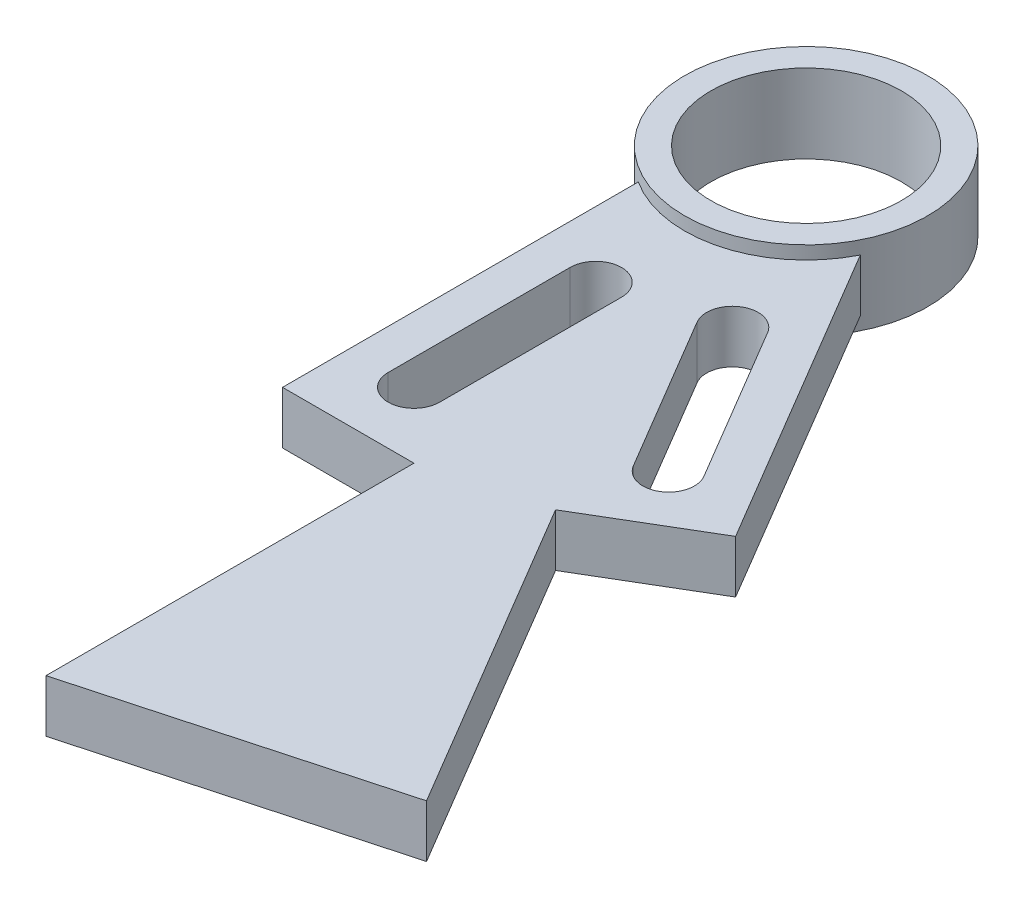
ISO-10303-21;
HEADER;
FILE_DESCRIPTION(('STEP AP214'),'2;1');
FILE_NAME('part.step','',(''),(''),'','','');
FILE_SCHEMA(('AUTOMOTIVE_DESIGN { 1 0 10303 214 1 1 1 1 }'));
ENDSEC;
DATA;
#1=APPLICATION_CONTEXT('core data for automotive mechanical design processes');
#2=APPLICATION_PROTOCOL_DEFINITION('international standard','automotive_design',2000,#1);
#3=PRODUCT_CONTEXT('',#1,'mechanical');
#4=PRODUCT('Part','Part','',(#3));
#5=PRODUCT_RELATED_PRODUCT_CATEGORY('part','',(#4));
#6=PRODUCT_DEFINITION_FORMATION('','',#4);
#7=PRODUCT_DEFINITION_CONTEXT('part definition',#1,'design');
#8=PRODUCT_DEFINITION('design','',#6,#7);
#9=PRODUCT_DEFINITION_SHAPE('','',#8);
#10=(LENGTH_UNIT() NAMED_UNIT(*) SI_UNIT(.MILLI.,.METRE.));
#11=(NAMED_UNIT(*) PLANE_ANGLE_UNIT() SI_UNIT($,.RADIAN.));
#12=(NAMED_UNIT(*) SI_UNIT($,.STERADIAN.) SOLID_ANGLE_UNIT());
#13=UNCERTAINTY_MEASURE_WITH_UNIT(LENGTH_MEASURE(1.E-05),#10,'distance_accuracy_value','');
#14=(GEOMETRIC_REPRESENTATION_CONTEXT(3) GLOBAL_UNCERTAINTY_ASSIGNED_CONTEXT((#13)) GLOBAL_UNIT_ASSIGNED_CONTEXT((#10,
#11,#12)) REPRESENTATION_CONTEXT('',''));
#15=CARTESIAN_POINT('',(0.,0.,0.));
#16=DIRECTION('',(0.,0.,1.));
#17=DIRECTION('',(1.,0.,0.));
#18=AXIS2_PLACEMENT_3D('',#15,#16,#17);
#19=CARTESIAN_POINT('',(0.,4.7625,0.));
#20=DIRECTION('',(0.,-1.,0.));
#21=DIRECTION('',(0.,0.,-1.));
#22=AXIS2_PLACEMENT_3D('',#19,#20,#21);
#23=CYLINDRICAL_SURFACE('',#22,11.5062);
#24=CARTESIAN_POINT('',(0.,4.7625,0.));
#25=DIRECTION('',(0.,1.,0.));
#26=DIRECTION('',(0.,0.,1.));
#27=AXIS2_PLACEMENT_3D('',#24,#25,#26);
#28=CIRCLE('',#27,11.5062);
#29=CARTESIAN_POINT('',(0.,4.7625,-11.5062));
#30=VERTEX_POINT('',#29);
#31=EDGE_CURVE('E53',#30,#30,#28,.T.);
#32=CARTESIAN_POINT('',(0.,-4.7625,0.));
#33=DIRECTION('',(0.,1.,0.));
#34=DIRECTION('',(0.,0.,1.));
#35=AXIS2_PLACEMENT_3D('',#32,#33,#34);
#36=CIRCLE('',#35,11.5062);
#37=CARTESIAN_POINT('',(0.,-4.7625,-11.5062));
#38=VERTEX_POINT('',#37);
#39=EDGE_CURVE('E273',#38,#38,#36,.T.);
#40=CARTESIAN_POINT('',(0.,4.7625,-11.5062));
#41=CARTESIAN_POINT('',(0.,4.66328125,-11.5062));
#42=CARTESIAN_POINT('',(0.,4.5640625,-11.5062));
#43=CARTESIAN_POINT('',(0.,4.365625,-11.5062));
#44=CARTESIAN_POINT('',(0.,4.26640625,-11.5062));
#45=CARTESIAN_POINT('',(0.,4.06796875,-11.5062));
#46=CARTESIAN_POINT('',(0.,3.96875,-11.5062));
#47=CARTESIAN_POINT('',(0.,3.7703125,-11.5062));
#48=CARTESIAN_POINT('',(0.,3.67109375,-11.5062));
#49=CARTESIAN_POINT('',(0.,3.47265625,-11.5062));
#50=CARTESIAN_POINT('',(0.,3.3734375,-11.5062));
#51=CARTESIAN_POINT('',(0.,3.175,-11.5062));
#52=CARTESIAN_POINT('',(0.,3.07578125,-11.5062));
#53=CARTESIAN_POINT('',(0.,2.87734375,-11.5062));
#54=CARTESIAN_POINT('',(0.,2.778125,-11.5062));
#55=CARTESIAN_POINT('',(0.,2.5796875,-11.5062));
#56=CARTESIAN_POINT('',(0.,2.48046875,-11.5062));
#57=CARTESIAN_POINT('',(0.,2.28203125,-11.5062));
#58=CARTESIAN_POINT('',(0.,2.1828125,-11.5062));
#59=CARTESIAN_POINT('',(0.,1.984375,-11.5062));
#60=CARTESIAN_POINT('',(0.,1.88515625,-11.5062));
#61=CARTESIAN_POINT('',(0.,1.68671875,-11.5062));
#62=CARTESIAN_POINT('',(0.,1.5875,-11.5062));
#63=CARTESIAN_POINT('',(0.,1.3890625,-11.5062));
#64=CARTESIAN_POINT('',(0.,1.28984375,-11.5062));
#65=CARTESIAN_POINT('',(0.,1.09140625,-11.5062));
#66=CARTESIAN_POINT('',(0.,0.992187499999999,-11.5062));
#67=CARTESIAN_POINT('',(0.,0.79375,-11.5062));
#68=CARTESIAN_POINT('',(0.,0.69453125,-11.5062));
#69=CARTESIAN_POINT('',(0.,0.49609375,-11.5062));
#70=CARTESIAN_POINT('',(0.,0.396875,-11.5062));
#71=CARTESIAN_POINT('',(0.,0.1984375,-11.5062));
#72=CARTESIAN_POINT('',(0.,0.0992187500000001,-11.5062));
#73=CARTESIAN_POINT('',(0.,-0.0992187500000001,-11.5062));
#74=CARTESIAN_POINT('',(0.,-0.1984375,-11.5062));
#75=CARTESIAN_POINT('',(0.,-0.396875,-11.5062));
#76=CARTESIAN_POINT('',(0.,-0.49609375,-11.5062));
#77=CARTESIAN_POINT('',(0.,-0.69453125,-11.5062));
#78=CARTESIAN_POINT('',(0.,-0.793750000000001,-11.5062));
#79=CARTESIAN_POINT('',(0.,-0.992187500000001,-11.5062));
#80=CARTESIAN_POINT('',(0.,-1.09140625,-11.5062));
#81=CARTESIAN_POINT('',(0.,-1.28984375,-11.5062));
#82=CARTESIAN_POINT('',(0.,-1.3890625,-11.5062));
#83=CARTESIAN_POINT('',(0.,-1.5875,-11.5062));
#84=CARTESIAN_POINT('',(0.,-1.68671875,-11.5062));
#85=CARTESIAN_POINT('',(0.,-1.88515625,-11.5062));
#86=CARTESIAN_POINT('',(0.,-1.984375,-11.5062));
#87=CARTESIAN_POINT('',(0.,-2.1828125,-11.5062));
#88=CARTESIAN_POINT('',(0.,-2.28203125,-11.5062));
#89=CARTESIAN_POINT('',(0.,-2.48046875,-11.5062));
#90=CARTESIAN_POINT('',(0.,-2.5796875,-11.5062));
#91=CARTESIAN_POINT('',(0.,-2.778125,-11.5062));
#92=CARTESIAN_POINT('',(0.,-2.87734375,-11.5062));
#93=CARTESIAN_POINT('',(0.,-3.07578125,-11.5062));
#94=CARTESIAN_POINT('',(0.,-3.175,-11.5062));
#95=CARTESIAN_POINT('',(0.,-3.3734375,-11.5062));
#96=CARTESIAN_POINT('',(0.,-3.47265625,-11.5062));
#97=CARTESIAN_POINT('',(0.,-3.67109375,-11.5062));
#98=CARTESIAN_POINT('',(0.,-3.7703125,-11.5062));
#99=CARTESIAN_POINT('',(0.,-3.96875,-11.5062));
#100=CARTESIAN_POINT('',(0.,-4.06796875,-11.5062));
#101=CARTESIAN_POINT('',(0.,-4.26640625,-11.5062));
#102=CARTESIAN_POINT('',(0.,-4.365625,-11.5062));
#103=CARTESIAN_POINT('',(0.,-4.5640625,-11.5062));
#104=CARTESIAN_POINT('',(0.,-4.66328125,-11.5062));
#105=CARTESIAN_POINT('',(0.,-4.7625,-11.5062));
#106=B_SPLINE_CURVE_WITH_KNOTS('',3,(#40,#41,#42,#43,#44,#45,#46,#47,#48,#49,#50,#51,#52,#53,
#54,#55,#56,#57,#58,#59,#60,#61,#62,#63,#64,#65,#66,#67,#68,#69,#70,#71,#72,#73,#74,#75,#76,#77,
#78,#79,#80,#81,#82,#83,#84,#85,#86,#87,#88,#89,#90,#91,#92,#93,#94,#95,#96,#97,#98,#99,#100,
#101,#102,#103,#104,#105),.UNSPECIFIED.,.F.,.F.,(4,2,2,2,2,2,2,2,2,2,2,2,2,2,2,2,2,2,2,2,2,2,2,
2,2,2,2,2,2,2,2,2,4),(0.,0.29765625,0.5953125,0.892968750000001,1.190625,1.48828125,1.7859375,
2.08359375,2.38125,2.67890625,2.9765625,3.27421875,3.571875,3.86953125,4.1671875,4.46484375,
4.7625,5.06015625,5.3578125,5.65546875,5.953125,6.25078125,6.5484375,6.84609375,7.14375,
7.44140625,7.7390625,8.03671875,8.334375,8.63203125,8.9296875,9.22734375,9.525),.UNSPECIFIED.);
#107=EDGE_CURVE('BSEAM45',#30,#38,#106,.T.);
#108=ORIENTED_EDGE('',*,*,#31,.T.);
#109=ORIENTED_EDGE('',*,*,#39,.F.);
#110=ORIENTED_EDGE('',*,*,#107,.T.);
#111=ORIENTED_EDGE('',*,*,#107,.F.);
#112=EDGE_LOOP('',(#108,#110,#109,#111));
#113=FACE_BOUND('',#112,.T.);
#114=ADVANCED_FACE('F45',(#113),#23,.F.);
#115=CARTESIAN_POINT('',(0.,4.7625,0.));
#116=DIRECTION('',(0.,-1.,0.));
#117=DIRECTION('',(0.,0.,-1.));
#118=AXIS2_PLACEMENT_3D('',#115,#116,#117);
#119=CYLINDRICAL_SURFACE('',#118,14.6812);
#120=DIRECTION('',(0.,-1.,0.));
#121=VECTOR('',#120,1.);
#122=CARTESIAN_POINT('',(-7.93749999999998,3.175,12.3504545337409));
#123=LINE('',#122,#121);
#124=CARTESIAN_POINT('',(-7.93749999999998,3.175,12.3504545337409));
#125=VERTEX_POINT('',#124);
#126=CARTESIAN_POINT('',(-7.93749999999998,-3.175,12.3504545337409));
#127=VERTEX_POINT('',#126);
#128=EDGE_CURVE('E66',#125,#127,#123,.T.);
#129=ORIENTED_EDGE('',*,*,#128,.F.);
#130=CARTESIAN_POINT('',(0.,3.175,0.));
#131=DIRECTION('',(0.,1.,0.));
#132=DIRECTION('',(0.,0.,1.));
#133=AXIS2_PLACEMENT_3D('',#130,#131,#132);
#134=CIRCLE('',#133,14.6812);
#135=CARTESIAN_POINT('',(13.1239528850336,3.175,6.58023511064909));
#136=VERTEX_POINT('',#135);
#137=EDGE_CURVE('E61',#125,#136,#134,.T.);
#138=ORIENTED_EDGE('',*,*,#137,.T.);
#139=DIRECTION('',(0.,-1.,0.));
#140=VECTOR('',#139,1.);
#141=CARTESIAN_POINT('',(13.1239528850336,3.175,6.58023511064909));
#142=LINE('',#141,#140);
#143=CARTESIAN_POINT('',(13.1239528850336,-3.175,6.58023511064909));
#144=VERTEX_POINT('',#143);
#145=EDGE_CURVE('E284',#136,#144,#142,.T.);
#146=ORIENTED_EDGE('',*,*,#145,.T.);
#147=CARTESIAN_POINT('',(0.,-3.175,0.));
#148=DIRECTION('',(0.,1.,0.));
#149=DIRECTION('',(0.,0.,1.));
#150=AXIS2_PLACEMENT_3D('',#147,#148,#149);
#151=CIRCLE('',#150,14.6812);
#152=EDGE_CURVE('E238',#127,#144,#151,.T.);
#153=ORIENTED_EDGE('',*,*,#152,.F.);
#154=EDGE_LOOP('',(#129,#138,#146,#153));
#155=FACE_BOUND('',#154,.T.);
#156=CARTESIAN_POINT('',(0.,4.7625,0.));
#157=DIRECTION('',(0.,1.,0.));
#158=DIRECTION('',(0.,0.,1.));
#159=AXIS2_PLACEMENT_3D('',#156,#157,#158);
#160=CIRCLE('',#159,14.6812);
#161=CARTESIAN_POINT('',(0.,4.7625,14.6812));
#162=VERTEX_POINT('',#161);
#163=EDGE_CURVE('E11',#162,#162,#160,.T.);
#164=ORIENTED_EDGE('',*,*,#163,.F.);
#165=EDGE_LOOP('',(#164));
#166=FACE_BOUND('',#165,.T.);
#167=CARTESIAN_POINT('',(0.,-4.7625,0.));
#168=DIRECTION('',(0.,1.,0.));
#169=DIRECTION('',(0.,0.,1.));
#170=AXIS2_PLACEMENT_3D('',#167,#168,#169);
#171=CIRCLE('',#170,14.6812);
#172=CARTESIAN_POINT('',(0.,-4.7625,14.6812));
#173=VERTEX_POINT('',#172);
#174=EDGE_CURVE('E48',#173,#173,#171,.T.);
#175=ORIENTED_EDGE('',*,*,#174,.T.);
#176=EDGE_LOOP('',(#175));
#177=FACE_BOUND('',#176,.T.);
#178=ADVANCED_FACE('F301',(#155,#166,#177),#119,.T.);
#179=CARTESIAN_POINT('',(0.,4.7625,0.));
#180=DIRECTION('',(0.,1.,0.));
#181=DIRECTION('',(0.,0.,1.));
#182=AXIS2_PLACEMENT_3D('',#179,#180,#181);
#183=PLANE('',#182);
#184=ORIENTED_EDGE('',*,*,#31,.F.);
#185=EDGE_LOOP('',(#184));
#186=FACE_BOUND('',#185,.T.);
#187=ORIENTED_EDGE('',*,*,#163,.T.);
#188=EDGE_LOOP('',(#187));
#189=FACE_BOUND('',#188,.T.);
#190=ADVANCED_FACE('F306',(#186,#189),#183,.T.);
#191=CARTESIAN_POINT('',(0.,-4.7625,0.));
#192=DIRECTION('',(0.,1.,0.));
#193=DIRECTION('',(0.,0.,1.));
#194=AXIS2_PLACEMENT_3D('',#191,#192,#193);
#195=PLANE('',#194);
#196=ORIENTED_EDGE('',*,*,#39,.T.);
#197=EDGE_LOOP('',(#196));
#198=FACE_BOUND('',#197,.T.);
#199=ORIENTED_EDGE('',*,*,#174,.F.);
#200=EDGE_LOOP('',(#199));
#201=FACE_BOUND('',#200,.T.);
#202=ADVANCED_FACE('F303',(#198,#201),#195,.F.);
#203=CARTESIAN_POINT('',(0.,3.175,25.4127));
#204=DIRECTION('',(0.,-1.,0.));
#205=DIRECTION('',(0.,0.,-1.));
#206=AXIS2_PLACEMENT_3D('',#203,#204,#205);
#207=CYLINDRICAL_SURFACE('',#206,3.1115);
#208=CARTESIAN_POINT('',(0.,-3.175,25.4127));
#209=DIRECTION('',(0.,1.,0.));
#210=DIRECTION('',(0.,0.,1.));
#211=AXIS2_PLACEMENT_3D('',#208,#209,#210);
#212=CIRCLE('',#211,3.1115);
#213=CARTESIAN_POINT('',(3.1115,-3.175,25.4127));
#214=VERTEX_POINT('',#213);
#215=CARTESIAN_POINT('',(-3.11150000000001,-3.175,25.4127));
#216=VERTEX_POINT('',#215);
#217=EDGE_CURVE('E253',#214,#216,#212,.T.);
#218=ORIENTED_EDGE('',*,*,#217,.F.);
#219=DIRECTION('',(0.,-1.,0.));
#220=VECTOR('',#219,1.);
#221=CARTESIAN_POINT('',(3.1115,3.175,25.4127));
#222=LINE('',#221,#220);
#223=CARTESIAN_POINT('',(3.1115,3.175,25.4127));
#224=VERTEX_POINT('',#223);
#225=EDGE_CURVE('E271',#224,#214,#222,.T.);
#226=ORIENTED_EDGE('',*,*,#225,.F.);
#227=CARTESIAN_POINT('',(0.,3.175,25.4127));
#228=DIRECTION('',(0.,1.,0.));
#229=DIRECTION('',(0.,0.,1.));
#230=AXIS2_PLACEMENT_3D('',#227,#228,#229);
#231=CIRCLE('',#230,3.1115);
#232=CARTESIAN_POINT('',(-3.11150000000001,3.175,25.4127));
#233=VERTEX_POINT('',#232);
#234=EDGE_CURVE('E208',#224,#233,#231,.T.);
#235=ORIENTED_EDGE('',*,*,#234,.T.);
#236=DIRECTION('',(0.,-1.,0.));
#237=VECTOR('',#236,1.);
#238=CARTESIAN_POINT('',(-3.11150000000001,3.175,25.4127));
#239=LINE('',#238,#237);
#240=EDGE_CURVE('E264',#233,#216,#239,.T.);
#241=ORIENTED_EDGE('',*,*,#240,.T.);
#242=EDGE_LOOP('',(#218,#226,#235,#241));
#243=FACE_BOUND('',#242,.T.);
#244=ADVANCED_FACE('F305',(#243),#207,.F.);
#245=CARTESIAN_POINT('',(3.11149999999999,3.175,0.));
#246=DIRECTION('',(-1.,0.,0.));
#247=DIRECTION('',(0.,0.,1.));
#248=AXIS2_PLACEMENT_3D('',#245,#246,#247);
#249=PLANE('',#248);
#250=DIRECTION('',(0.,0.,-1.));
#251=VECTOR('',#250,1.);
#252=CARTESIAN_POINT('',(3.11149999999999,-3.175,0.));
#253=LINE('',#252,#251);
#254=CARTESIAN_POINT('',(3.1115,-3.175,47.3837));
#255=VERTEX_POINT('',#254);
#256=EDGE_CURVE('E256',#255,#214,#253,.T.);
#257=ORIENTED_EDGE('',*,*,#256,.F.);
#258=DIRECTION('',(0.,-1.,0.));
#259=VECTOR('',#258,1.);
#260=CARTESIAN_POINT('',(3.1115,3.175,47.3837));
#261=LINE('',#260,#259);
#262=CARTESIAN_POINT('',(3.1115,3.175,47.3837));
#263=VERTEX_POINT('',#262);
#264=EDGE_CURVE('E269',#263,#255,#261,.T.);
#265=ORIENTED_EDGE('',*,*,#264,.F.);
#266=DIRECTION('',(0.,0.,-1.));
#267=VECTOR('',#266,1.);
#268=CARTESIAN_POINT('',(3.11149999999999,3.175,0.));
#269=LINE('',#268,#267);
#270=EDGE_CURVE('E211',#263,#224,#269,.T.);
#271=ORIENTED_EDGE('',*,*,#270,.T.);
#272=ORIENTED_EDGE('',*,*,#225,.T.);
#273=EDGE_LOOP('',(#257,#265,#271,#272));
#274=FACE_BOUND('',#273,.T.);
#275=ADVANCED_FACE('F313',(#274),#249,.T.);
#276=CARTESIAN_POINT('',(0.,3.175,47.3837));
#277=DIRECTION('',(0.,-1.,0.));
#278=DIRECTION('',(0.,0.,-1.));
#279=AXIS2_PLACEMENT_3D('',#276,#277,#278);
#280=CYLINDRICAL_SURFACE('',#279,3.1115);
#281=CARTESIAN_POINT('',(0.,-3.175,47.3837));
#282=DIRECTION('',(0.,1.,0.));
#283=DIRECTION('',(0.,0.,1.));
#284=AXIS2_PLACEMENT_3D('',#281,#282,#283);
#285=CIRCLE('',#284,3.1115);
#286=CARTESIAN_POINT('',(-3.1115,-3.175,47.3837));
#287=VERTEX_POINT('',#286);
#288=EDGE_CURVE('E259',#287,#255,#285,.T.);
#289=ORIENTED_EDGE('',*,*,#288,.F.);
#290=DIRECTION('',(0.,-1.,0.));
#291=VECTOR('',#290,1.);
#292=CARTESIAN_POINT('',(-3.1115,3.175,47.3837));
#293=LINE('',#292,#291);
#294=CARTESIAN_POINT('',(-3.1115,3.175,47.3837));
#295=VERTEX_POINT('',#294);
#296=EDGE_CURVE('E266',#295,#287,#293,.T.);
#297=ORIENTED_EDGE('',*,*,#296,.F.);
#298=CARTESIAN_POINT('',(0.,3.175,47.3837));
#299=DIRECTION('',(0.,1.,0.));
#300=DIRECTION('',(0.,0.,1.));
#301=AXIS2_PLACEMENT_3D('',#298,#299,#300);
#302=CIRCLE('',#301,3.1115);
#303=EDGE_CURVE('E214',#295,#263,#302,.T.);
#304=ORIENTED_EDGE('',*,*,#303,.T.);
#305=ORIENTED_EDGE('',*,*,#264,.T.);
#306=EDGE_LOOP('',(#289,#297,#304,#305));
#307=FACE_BOUND('',#306,.T.);
#308=ADVANCED_FACE('F342',(#307),#280,.F.);
#309=CARTESIAN_POINT('',(-6.82911899995999,3.175,4.04561984550982));
#310=DIRECTION('',(0.860361448813874,0.,-0.5096843899855));
#311=DIRECTION('',(-0.5096843899855,0.,-0.860361448813874));
#312=AXIS2_PLACEMENT_3D('',#309,#310,#311);
#313=PLANE('',#312);
#314=DIRECTION('',(0.5096843899855,0.,0.860361448813874));
#315=VECTOR('',#314,1.);
#316=CARTESIAN_POINT('',(-6.82911899995999,-3.175,4.04561984550982));
#317=LINE('',#316,#315);
#318=CARTESIAN_POINT('',(21.3672330753059,-3.175,51.6418476276319));
#319=VERTEX_POINT('',#318);
#320=CARTESIAN_POINT('',(44.0227042101614,-3.175,89.8849140274086));
#321=VERTEX_POINT('',#320);
#322=EDGE_CURVE('E229',#319,#321,#317,.T.);
#323=ORIENTED_EDGE('',*,*,#322,.F.);
#324=DIRECTION('',(0.,-1.,0.));
#325=VECTOR('',#324,1.);
#326=CARTESIAN_POINT('',(21.3672330753059,3.175,51.6418476276319));
#327=LINE('',#326,#325);
#328=CARTESIAN_POINT('',(21.3672330753059,3.175,51.6418476276319));
#329=VERTEX_POINT('',#328);
#330=EDGE_CURVE('E267',#329,#319,#327,.T.);
#331=ORIENTED_EDGE('',*,*,#330,.F.);
#332=DIRECTION('',(0.5096843899855,0.,0.860361448813874));
#333=VECTOR('',#332,1.);
#334=CARTESIAN_POINT('',(-6.82911899995999,3.175,4.04561984550982));
#335=LINE('',#334,#333);
#336=CARTESIAN_POINT('',(44.0227042101614,3.175,89.8849140274086));
#337=VERTEX_POINT('',#336);
#338=EDGE_CURVE('E188',#329,#337,#335,.T.);
#339=ORIENTED_EDGE('',*,*,#338,.T.);
#340=DIRECTION('',(0.,-1.,0.));
#341=VECTOR('',#340,1.);
#342=CARTESIAN_POINT('',(44.0227042101614,3.175,89.8849140274086));
#343=LINE('',#342,#341);
#344=EDGE_CURVE('E167',#337,#321,#343,.T.);
#345=ORIENTED_EDGE('',*,*,#344,.T.);
#346=EDGE_LOOP('',(#323,#331,#339,#345));
#347=FACE_BOUND('',#346,.T.);
#348=ADVANCED_FACE('F351',(#347),#313,.T.);
#349=CARTESIAN_POINT('',(28.1963520752659,3.175,47.5962277821221));
#350=DIRECTION('',(-0.5096843899855,0.,-0.860361448813874));
#351=DIRECTION('',(-0.860361448813874,0.,0.509684389985501));
#352=AXIS2_PLACEMENT_3D('',#349,#350,#351);
#353=PLANE('',#352);
#354=DIRECTION('',(0.860361448813874,0.,-0.5096843899855));
#355=VECTOR('',#354,1.);
#356=CARTESIAN_POINT('',(28.1963520752659,-3.175,47.5962277821221));
#357=LINE('',#356,#355);
#358=CARTESIAN_POINT('',(35.0254710752261,-3.175,43.5506079366121));
#359=VERTEX_POINT('',#358);
#360=EDGE_CURVE('E232',#319,#359,#357,.T.);
#361=ORIENTED_EDGE('',*,*,#360,.T.);
#362=DIRECTION('',(0.,-1.,0.));
#363=VECTOR('',#362,1.);
#364=CARTESIAN_POINT('',(35.0254710752261,3.175,43.5506079366121));
#365=LINE('',#364,#363);
#366=CARTESIAN_POINT('',(35.0254710752261,3.175,43.5506079366121));
#367=VERTEX_POINT('',#366);
#368=EDGE_CURVE('E286',#367,#359,#365,.T.);
#369=ORIENTED_EDGE('',*,*,#368,.F.);
#370=DIRECTION('',(0.860361448813874,0.,-0.5096843899855));
#371=VECTOR('',#370,1.);
#372=CARTESIAN_POINT('',(28.1963520752659,3.175,47.5962277821221));
#373=LINE('',#372,#371);
#374=EDGE_CURVE('E191',#329,#367,#373,.T.);
#375=ORIENTED_EDGE('',*,*,#374,.F.);
#376=ORIENTED_EDGE('',*,*,#330,.T.);
#377=EDGE_LOOP('',(#361,#369,#375,#376));
#378=FACE_BOUND('',#377,.T.);
#379=ADVANCED_FACE('F360',(#378),#353,.F.);
#380=CARTESIAN_POINT('',(6.82911899996026,3.175,-4.04561984550999));
#381=DIRECTION('',(-0.860361448813874,0.,0.5096843899855));
#382=DIRECTION('',(0.5096843899855,0.,0.860361448813874));
#383=AXIS2_PLACEMENT_3D('',#380,#381,#382);
#384=PLANE('',#383);
#385=DIRECTION('',(-0.5096843899855,0.,-0.860361448813874));
#386=VECTOR('',#385,1.);
#387=CARTESIAN_POINT('',(6.82911899996026,-3.175,-4.04561984550999));
#388=LINE('',#387,#386);
#389=EDGE_CURVE('E235',#359,#144,#388,.T.);
#390=ORIENTED_EDGE('',*,*,#389,.T.);
#391=ORIENTED_EDGE('',*,*,#145,.F.);
#392=DIRECTION('',(-0.5096843899855,0.,-0.860361448813874));
#393=VECTOR('',#392,1.);
#394=CARTESIAN_POINT('',(6.82911899996026,3.175,-4.04561984550999));
#395=LINE('',#394,#393);
#396=EDGE_CURVE('E194',#367,#136,#395,.T.);
#397=ORIENTED_EDGE('',*,*,#396,.F.);
#398=ORIENTED_EDGE('',*,*,#368,.T.);
#399=EDGE_LOOP('',(#390,#391,#397,#398));
#400=FACE_BOUND('',#399,.T.);
#401=ADVANCED_FACE('F369',(#400),#384,.F.);
#402=CARTESIAN_POINT('',(-7.93749999999998,3.175,0.));
#403=DIRECTION('',(-1.,0.,0.));
#404=DIRECTION('',(0.,0.,1.));
#405=AXIS2_PLACEMENT_3D('',#402,#403,#404);
#406=PLANE('',#405);
#407=DIRECTION('',(0.,0.,-1.));
#408=VECTOR('',#407,1.);
#409=CARTESIAN_POINT('',(-7.93749999999998,-3.175,0.));
#410=LINE('',#409,#408);
#411=CARTESIAN_POINT('',(-7.93749999999998,-3.175,55.3212));
#412=VERTEX_POINT('',#411);
#413=EDGE_CURVE('E241',#412,#127,#410,.T.);
#414=ORIENTED_EDGE('',*,*,#413,.F.);
#415=DIRECTION('',(0.,-1.,0.));
#416=VECTOR('',#415,1.);
#417=CARTESIAN_POINT('',(-7.93749999999998,3.175,55.3212));
#418=LINE('',#417,#416);
#419=CARTESIAN_POINT('',(-7.93749999999998,3.175,55.3212));
#420=VERTEX_POINT('',#419);
#421=EDGE_CURVE('E281',#420,#412,#418,.T.);
#422=ORIENTED_EDGE('',*,*,#421,.F.);
#423=DIRECTION('',(0.,0.,-1.));
#424=VECTOR('',#423,1.);
#425=CARTESIAN_POINT('',(-7.93749999999998,3.175,0.));
#426=LINE('',#425,#424);
#427=EDGE_CURVE('E197',#420,#125,#426,.T.);
#428=ORIENTED_EDGE('',*,*,#427,.T.);
#429=ORIENTED_EDGE('',*,*,#128,.T.);
#430=EDGE_LOOP('',(#414,#422,#428,#429));
#431=FACE_BOUND('',#430,.T.);
#432=ADVANCED_FACE('F378',(#431),#406,.T.);
#433=CARTESIAN_POINT('',(0.,3.175,55.3212));
#434=DIRECTION('',(0.,0.,-1.));
#435=DIRECTION('',(-1.,0.,0.));
#436=AXIS2_PLACEMENT_3D('',#433,#434,#435);
#437=PLANE('',#436);
#438=DIRECTION('',(1.,0.,0.));
#439=VECTOR('',#438,1.);
#440=CARTESIAN_POINT('',(0.,-3.175,55.3212));
#441=LINE('',#440,#439);
#442=CARTESIAN_POINT('',(7.93750000000002,-3.175,55.3212));
#443=VERTEX_POINT('',#442);
#444=EDGE_CURVE('E244',#412,#443,#441,.T.);
#445=ORIENTED_EDGE('',*,*,#444,.T.);
#446=DIRECTION('',(0.,-1.,0.));
#447=VECTOR('',#446,1.);
#448=CARTESIAN_POINT('',(7.93750000000002,3.175,55.3212));
#449=LINE('',#448,#447);
#450=CARTESIAN_POINT('',(7.93750000000002,3.175,55.3212));
#451=VERTEX_POINT('',#450);
#452=EDGE_CURVE('E278',#451,#443,#449,.T.);
#453=ORIENTED_EDGE('',*,*,#452,.F.);
#454=DIRECTION('',(1.,0.,0.));
#455=VECTOR('',#454,1.);
#456=CARTESIAN_POINT('',(0.,3.175,55.3212));
#457=LINE('',#456,#455);
#458=EDGE_CURVE('E200',#420,#451,#457,.T.);
#459=ORIENTED_EDGE('',*,*,#458,.F.);
#460=ORIENTED_EDGE('',*,*,#421,.T.);
#461=EDGE_LOOP('',(#445,#453,#459,#460));
#462=FACE_BOUND('',#461,.T.);
#463=ADVANCED_FACE('F387',(#462),#437,.F.);
#464=CARTESIAN_POINT('',(7.93750000000005,3.175,0.));
#465=DIRECTION('',(1.,0.,0.));
#466=DIRECTION('',(0.,0.,-1.));
#467=AXIS2_PLACEMENT_3D('',#464,#465,#466);
#468=PLANE('',#467);
#469=DIRECTION('',(0.,0.,1.));
#470=VECTOR('',#469,1.);
#471=CARTESIAN_POINT('',(7.93750000000005,-3.175,0.));
#472=LINE('',#471,#470);
#473=CARTESIAN_POINT('',(7.9375,-3.175,99.7712));
#474=VERTEX_POINT('',#473);
#475=EDGE_CURVE('E247',#443,#474,#472,.T.);
#476=ORIENTED_EDGE('',*,*,#475,.T.);
#477=DIRECTION('',(0.,-1.,0.));
#478=VECTOR('',#477,1.);
#479=CARTESIAN_POINT('',(7.9375,3.175,99.7712));
#480=LINE('',#479,#478);
#481=CARTESIAN_POINT('',(7.9375,3.175,99.7712));
#482=VERTEX_POINT('',#481);
#483=EDGE_CURVE('E275',#482,#474,#480,.T.);
#484=ORIENTED_EDGE('',*,*,#483,.F.);
#485=DIRECTION('',(0.,0.,1.));
#486=VECTOR('',#485,1.);
#487=CARTESIAN_POINT('',(7.93750000000005,3.175,0.));
#488=LINE('',#487,#486);
#489=EDGE_CURVE('E203',#451,#482,#488,.T.);
#490=ORIENTED_EDGE('',*,*,#489,.F.);
#491=ORIENTED_EDGE('',*,*,#452,.T.);
#492=EDGE_LOOP('',(#476,#484,#490,#491));
#493=FACE_BOUND('',#492,.T.);
#494=ADVANCED_FACE('F396',(#493),#468,.F.);
#495=CARTESIAN_POINT('',(24.1507322297562,3.175,40.7671087821618));
#496=DIRECTION('',(0.,-1.,0.));
#497=DIRECTION('',(0.,0.,-1.));
#498=AXIS2_PLACEMENT_3D('',#495,#496,#497);
#499=CYLINDRICAL_SURFACE('',#498,3.11150000000005);
#500=CARTESIAN_POINT('',(24.1507322297562,-3.175,40.7671087821618));
#501=DIRECTION('',(0.,1.,0.));
#502=DIRECTION('',(0.,0.,1.));
#503=AXIS2_PLACEMENT_3D('',#500,#501,#502);
#504=CIRCLE('',#503,3.11150000000005);
#505=CARTESIAN_POINT('',(21.4737175817717,-3.175,42.3529917616018));
#506=VERTEX_POINT('',#505);
#507=CARTESIAN_POINT('',(26.8277468777405,-3.175,39.181225802722));
#508=VERTEX_POINT('',#507);
#509=EDGE_CURVE('E162',#506,#508,#504,.T.);
#510=ORIENTED_EDGE('',*,*,#509,.F.);
#511=DIRECTION('',(0.,-1.,0.));
#512=VECTOR('',#511,1.);
#513=CARTESIAN_POINT('',(21.4737175817717,3.175,42.3529917616018));
#514=LINE('',#513,#512);
#515=CARTESIAN_POINT('',(21.4737175817717,3.175,42.3529917616018));
#516=VERTEX_POINT('',#515);
#517=EDGE_CURVE('E157',#516,#506,#514,.T.);
#518=ORIENTED_EDGE('',*,*,#517,.F.);
#519=CARTESIAN_POINT('',(24.1507322297562,3.175,40.7671087821618));
#520=DIRECTION('',(0.,1.,0.));
#521=DIRECTION('',(0.,0.,1.));
#522=AXIS2_PLACEMENT_3D('',#519,#520,#521);
#523=CIRCLE('',#522,3.11150000000005);
#524=CARTESIAN_POINT('',(26.8277468777405,3.175,39.181225802722));
#525=VERTEX_POINT('',#524);
#526=EDGE_CURVE('E160',#516,#525,#523,.T.);
#527=ORIENTED_EDGE('',*,*,#526,.T.);
#528=DIRECTION('',(0.,-1.,0.));
#529=VECTOR('',#528,1.);
#530=CARTESIAN_POINT('',(26.8277468777405,3.175,39.181225802722));
#531=LINE('',#530,#529);
#532=EDGE_CURVE('E219',#525,#508,#531,.T.);
#533=ORIENTED_EDGE('',*,*,#532,.T.);
#534=EDGE_LOOP('',(#510,#518,#527,#533));
#535=FACE_BOUND('',#534,.T.);
#536=ADVANCED_FACE('F159',(#535),#499,.F.);
#537=CARTESIAN_POINT('',(-2.67701464798426,3.175,1.58588297943982));
#538=DIRECTION('',(0.860361448813874,0.,-0.509684389985501));
#539=DIRECTION('',(-0.509684389985501,0.,-0.860361448813874));
#540=AXIS2_PLACEMENT_3D('',#537,#538,#539);
#541=PLANE('',#540);
#542=DIRECTION('',(0.509684389985501,0.,0.860361448813874));
#543=VECTOR('',#542,1.);
#544=CARTESIAN_POINT('',(-2.67701464798426,-3.175,1.58588297943982));
#545=LINE('',#544,#543);
#546=CARTESIAN_POINT('',(10.2754418494003,-3.175,23.4499903697122));
#547=VERTEX_POINT('',#546);
#548=EDGE_CURVE('E221',#547,#506,#545,.T.);
#549=ORIENTED_EDGE('',*,*,#548,.F.);
#550=DIRECTION('',(0.,-1.,0.));
#551=VECTOR('',#550,1.);
#552=CARTESIAN_POINT('',(10.2754418494003,3.175,23.4499903697122));
#553=LINE('',#552,#551);
#554=CARTESIAN_POINT('',(10.2754418494003,3.175,23.4499903697122));
#555=VERTEX_POINT('',#554);
#556=EDGE_CURVE('E168',#555,#547,#553,.T.);
#557=ORIENTED_EDGE('',*,*,#556,.F.);
#558=DIRECTION('',(0.509684389985501,0.,0.860361448813874));
#559=VECTOR('',#558,1.);
#560=CARTESIAN_POINT('',(-2.67701464798426,3.175,1.58588297943982));
#561=LINE('',#560,#559);
#562=EDGE_CURVE('E175',#555,#516,#561,.T.);
#563=ORIENTED_EDGE('',*,*,#562,.T.);
#564=ORIENTED_EDGE('',*,*,#517,.T.);
#565=EDGE_LOOP('',(#549,#557,#563,#564));
#566=FACE_BOUND('',#565,.T.);
#567=ADVANCED_FACE('F182',(#566),#541,.T.);
#568=CARTESIAN_POINT('',(12.9524564973847,3.175,21.8641073902722));
#569=DIRECTION('',(0.,-1.,0.));
#570=DIRECTION('',(0.,0.,-1.));
#571=AXIS2_PLACEMENT_3D('',#568,#569,#570);
#572=CYLINDRICAL_SURFACE('',#571,3.11150000000004);
#573=CARTESIAN_POINT('',(12.9524564973847,-3.175,21.8641073902722));
#574=DIRECTION('',(0.,1.,0.));
#575=DIRECTION('',(0.,0.,1.));
#576=AXIS2_PLACEMENT_3D('',#573,#574,#575);
#577=CIRCLE('',#576,3.11150000000004);
#578=CARTESIAN_POINT('',(15.6294711453691,-3.175,20.2782244108323));
#579=VERTEX_POINT('',#578);
#580=EDGE_CURVE('E223',#579,#547,#577,.T.);
#581=ORIENTED_EDGE('',*,*,#580,.F.);
#582=DIRECTION('',(0.,-1.,0.));
#583=VECTOR('',#582,1.);
#584=CARTESIAN_POINT('',(15.6294711453691,3.175,20.2782244108323));
#585=LINE('',#584,#583);
#586=CARTESIAN_POINT('',(15.6294711453691,3.175,20.2782244108323));
#587=VERTEX_POINT('',#586);
#588=EDGE_CURVE('E291',#587,#579,#585,.T.);
#589=ORIENTED_EDGE('',*,*,#588,.F.);
#590=CARTESIAN_POINT('',(12.9524564973847,3.175,21.8641073902722));
#591=DIRECTION('',(0.,1.,0.));
#592=DIRECTION('',(0.,0.,1.));
#593=AXIS2_PLACEMENT_3D('',#590,#591,#592);
#594=CIRCLE('',#593,3.11150000000004);
#595=EDGE_CURVE('E183',#587,#555,#594,.T.);
#596=ORIENTED_EDGE('',*,*,#595,.T.);
#597=ORIENTED_EDGE('',*,*,#556,.T.);
#598=EDGE_LOOP('',(#581,#589,#596,#597));
#599=FACE_BOUND('',#598,.T.);
#600=ADVANCED_FACE('F420',(#599),#572,.F.);
#601=CARTESIAN_POINT('',(25.9801021050806,3.175,94.8280570137043));
#602=DIRECTION('',(-0.264233373352162,0.,-0.964458772787586));
#603=DIRECTION('',(-0.964458772787586,0.,0.264233373352162));
#604=AXIS2_PLACEMENT_3D('',#601,#602,#603);
#605=PLANE('',#604);
#606=DIRECTION('',(0.964458772787586,0.,-0.264233373352162));
#607=VECTOR('',#606,1.);
#608=CARTESIAN_POINT('',(25.9801021050806,-3.175,94.8280570137043));
#609=LINE('',#608,#607);
#610=EDGE_CURVE('E250',#474,#321,#609,.T.);
#611=ORIENTED_EDGE('',*,*,#610,.T.);
#612=ORIENTED_EDGE('',*,*,#344,.F.);
#613=DIRECTION('',(0.964458772787586,0.,-0.264233373352162));
#614=VECTOR('',#613,1.);
#615=CARTESIAN_POINT('',(25.9801021050806,3.175,94.8280570137043));
#616=LINE('',#615,#614);
#617=EDGE_CURVE('E206',#482,#337,#616,.T.);
#618=ORIENTED_EDGE('',*,*,#617,.F.);
#619=ORIENTED_EDGE('',*,*,#483,.T.);
#620=EDGE_LOOP('',(#611,#612,#618,#619));
#621=FACE_BOUND('',#620,.T.);
#622=ADVANCED_FACE('F428',(#621),#605,.F.);
#623=CARTESIAN_POINT('',(2.67701464798452,3.175,-1.58588297943998));
#624=DIRECTION('',(0.860361448813873,0.,-0.509684389985502));
#625=DIRECTION('',(-0.509684389985502,0.,-0.860361448813873));
#626=AXIS2_PLACEMENT_3D('',#623,#624,#625);
#627=PLANE('',#626);
#628=DIRECTION('',(0.509684389985502,0.,0.860361448813873));
#629=VECTOR('',#628,1.);
#630=CARTESIAN_POINT('',(2.67701464798452,-3.175,-1.58588297943998));
#631=LINE('',#630,#629);
#632=EDGE_CURVE('E226',#579,#508,#631,.T.);
#633=ORIENTED_EDGE('',*,*,#632,.T.);
#634=ORIENTED_EDGE('',*,*,#532,.F.);
#635=DIRECTION('',(0.509684389985502,0.,0.860361448813873));
#636=VECTOR('',#635,1.);
#637=CARTESIAN_POINT('',(2.67701464798452,3.175,-1.58588297943998));
#638=LINE('',#637,#636);
#639=EDGE_CURVE('E178',#587,#525,#638,.T.);
#640=ORIENTED_EDGE('',*,*,#639,.F.);
#641=ORIENTED_EDGE('',*,*,#588,.T.);
#642=EDGE_LOOP('',(#633,#634,#640,#641));
#643=FACE_BOUND('',#642,.T.);
#644=ADVANCED_FACE('F437',(#643),#627,.F.);
#645=CARTESIAN_POINT('',(-3.11150000000001,3.175,0.));
#646=DIRECTION('',(-1.,0.,0.));
#647=DIRECTION('',(0.,0.,1.));
#648=AXIS2_PLACEMENT_3D('',#645,#646,#647);
#649=PLANE('',#648);
#650=DIRECTION('',(0.,0.,-1.));
#651=VECTOR('',#650,1.);
#652=CARTESIAN_POINT('',(-3.11150000000001,-3.175,0.));
#653=LINE('',#652,#651);
#654=EDGE_CURVE('E180',#287,#216,#653,.T.);
#655=ORIENTED_EDGE('',*,*,#654,.T.);
#656=ORIENTED_EDGE('',*,*,#240,.F.);
#657=DIRECTION('',(0.,0.,-1.));
#658=VECTOR('',#657,1.);
#659=CARTESIAN_POINT('',(-3.11150000000001,3.175,0.));
#660=LINE('',#659,#658);
#661=EDGE_CURVE('E217',#295,#233,#660,.T.);
#662=ORIENTED_EDGE('',*,*,#661,.F.);
#663=ORIENTED_EDGE('',*,*,#296,.T.);
#664=EDGE_LOOP('',(#655,#656,#662,#663));
#665=FACE_BOUND('',#664,.T.);
#666=ADVANCED_FACE('F446',(#665),#649,.F.);
#667=CARTESIAN_POINT('',(0.,3.175,0.));
#668=DIRECTION('',(0.,1.,0.));
#669=DIRECTION('',(0.,0.,1.));
#670=AXIS2_PLACEMENT_3D('',#667,#668,#669);
#671=PLANE('',#670);
#672=ORIENTED_EDGE('',*,*,#526,.F.);
#673=ORIENTED_EDGE('',*,*,#562,.F.);
#674=ORIENTED_EDGE('',*,*,#595,.F.);
#675=ORIENTED_EDGE('',*,*,#639,.T.);
#676=EDGE_LOOP('',(#672,#673,#674,#675));
#677=FACE_BOUND('',#676,.T.);
#678=ORIENTED_EDGE('',*,*,#338,.F.);
#679=ORIENTED_EDGE('',*,*,#374,.T.);
#680=ORIENTED_EDGE('',*,*,#396,.T.);
#681=ORIENTED_EDGE('',*,*,#137,.F.);
#682=ORIENTED_EDGE('',*,*,#427,.F.);
#683=ORIENTED_EDGE('',*,*,#458,.T.);
#684=ORIENTED_EDGE('',*,*,#489,.T.);
#685=ORIENTED_EDGE('',*,*,#617,.T.);
#686=EDGE_LOOP('',(#678,#679,#680,#681,#682,#683,#684,#685));
#687=FACE_BOUND('',#686,.T.);
#688=ORIENTED_EDGE('',*,*,#234,.F.);
#689=ORIENTED_EDGE('',*,*,#270,.F.);
#690=ORIENTED_EDGE('',*,*,#303,.F.);
#691=ORIENTED_EDGE('',*,*,#661,.T.);
#692=EDGE_LOOP('',(#688,#689,#690,#691));
#693=FACE_BOUND('',#692,.T.);
#694=ADVANCED_FACE('F172',(#677,#687,#693),#671,.T.);
#695=CARTESIAN_POINT('',(0.,-3.175,0.));
#696=DIRECTION('',(0.,1.,0.));
#697=DIRECTION('',(0.,0.,1.));
#698=AXIS2_PLACEMENT_3D('',#695,#696,#697);
#699=PLANE('',#698);
#700=ORIENTED_EDGE('',*,*,#509,.T.);
#701=ORIENTED_EDGE('',*,*,#632,.F.);
#702=ORIENTED_EDGE('',*,*,#580,.T.);
#703=ORIENTED_EDGE('',*,*,#548,.T.);
#704=EDGE_LOOP('',(#700,#701,#702,#703));
#705=FACE_BOUND('',#704,.T.);
#706=ORIENTED_EDGE('',*,*,#322,.T.);
#707=ORIENTED_EDGE('',*,*,#610,.F.);
#708=ORIENTED_EDGE('',*,*,#475,.F.);
#709=ORIENTED_EDGE('',*,*,#444,.F.);
#710=ORIENTED_EDGE('',*,*,#413,.T.);
#711=ORIENTED_EDGE('',*,*,#152,.T.);
#712=ORIENTED_EDGE('',*,*,#389,.F.);
#713=ORIENTED_EDGE('',*,*,#360,.F.);
#714=EDGE_LOOP('',(#706,#707,#708,#709,#710,#711,#712,#713));
#715=FACE_BOUND('',#714,.T.);
#716=ORIENTED_EDGE('',*,*,#217,.T.);
#717=ORIENTED_EDGE('',*,*,#654,.F.);
#718=ORIENTED_EDGE('',*,*,#288,.T.);
#719=ORIENTED_EDGE('',*,*,#256,.T.);
#720=EDGE_LOOP('',(#716,#717,#718,#719));
#721=FACE_BOUND('',#720,.T.);
#722=ADVANCED_FACE('F463',(#705,#715,#721),#699,.F.);
#723=CLOSED_SHELL('',(#114,#178,#190,#202,#244,#275,#308,#348,#379,#401,#432,#463,#494,#536,
#567,#600,#622,#644,#666,#694,#722));
#724=MANIFOLD_SOLID_BREP('B2',#723);
#725=ADVANCED_BREP_SHAPE_REPRESENTATION('',(#18,#724),#14);
#726=SHAPE_DEFINITION_REPRESENTATION(#9,#725);
ENDSEC;
END-ISO-10303-21;
